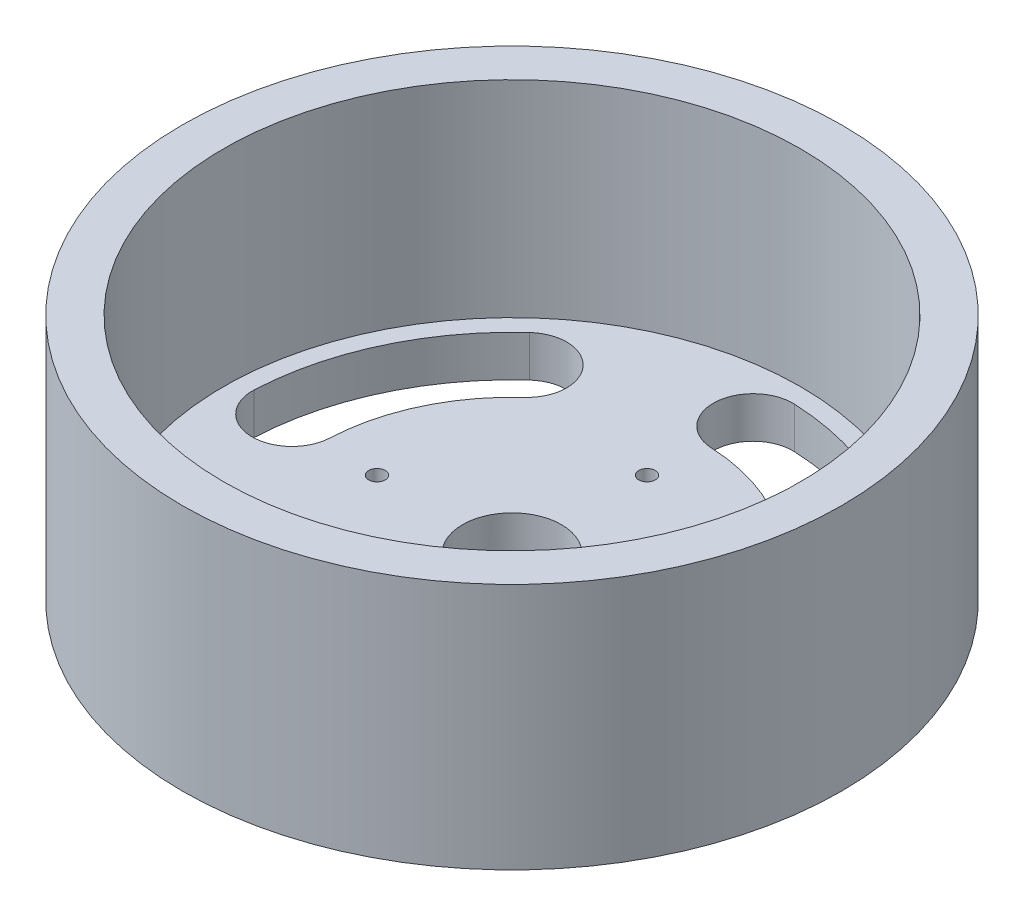
ISO-10303-21;
HEADER;
FILE_DESCRIPTION(('STEP AP214'),'2;1');
FILE_NAME('part.step','',(''),(''),'','','');
FILE_SCHEMA(('AUTOMOTIVE_DESIGN { 1 0 10303 214 1 1 1 1 }'));
ENDSEC;
DATA;
#1=APPLICATION_CONTEXT('core data for automotive mechanical design processes');
#2=APPLICATION_PROTOCOL_DEFINITION('international standard','automotive_design',2000,#1);
#3=PRODUCT_CONTEXT('',#1,'mechanical');
#4=PRODUCT('Part','Part','',(#3));
#5=PRODUCT_RELATED_PRODUCT_CATEGORY('part','',(#4));
#6=PRODUCT_DEFINITION_FORMATION('','',#4);
#7=PRODUCT_DEFINITION_CONTEXT('part definition',#1,'design');
#8=PRODUCT_DEFINITION('design','',#6,#7);
#9=PRODUCT_DEFINITION_SHAPE('','',#8);
#10=(LENGTH_UNIT() NAMED_UNIT(*) SI_UNIT(.MILLI.,.METRE.));
#11=(NAMED_UNIT(*) PLANE_ANGLE_UNIT() SI_UNIT($,.RADIAN.));
#12=(NAMED_UNIT(*) SI_UNIT($,.STERADIAN.) SOLID_ANGLE_UNIT());
#13=UNCERTAINTY_MEASURE_WITH_UNIT(LENGTH_MEASURE(1.E-05),#10,'distance_accuracy_value','');
#14=(GEOMETRIC_REPRESENTATION_CONTEXT(3) GLOBAL_UNCERTAINTY_ASSIGNED_CONTEXT((#13)) GLOBAL_UNIT_ASSIGNED_CONTEXT((#10,
#11,#12)) REPRESENTATION_CONTEXT('',''));
#15=CARTESIAN_POINT('',(0.,0.,0.));
#16=DIRECTION('',(0.,0.,1.));
#17=DIRECTION('',(1.,0.,0.));
#18=AXIS2_PLACEMENT_3D('',#15,#16,#17);
#19=CARTESIAN_POINT('',(0.,5.,0.));
#20=DIRECTION('',(0.,1.,0.));
#21=DIRECTION('',(0.,0.,1.));
#22=AXIS2_PLACEMENT_3D('',#19,#20,#21);
#23=PLANE('',#22);
#24=CARTESIAN_POINT('',(0.,5.,0.));
#25=DIRECTION('',(0.,1.,0.));
#26=DIRECTION('',(0.,0.,1.));
#27=AXIS2_PLACEMENT_3D('',#24,#25,#26);
#28=CIRCLE('',#27,35.);
#29=CARTESIAN_POINT('',(0.,5.,35.));
#30=VERTEX_POINT('',#29);
#31=EDGE_CURVE('E370',#30,#30,#28,.T.);
#32=ORIENTED_EDGE('',*,*,#31,.T.);
#33=EDGE_LOOP('',(#32));
#34=FACE_BOUND('',#33,.T.);
#35=CARTESIAN_POINT('',(-1.27613354937582,5.,27.9709042250006));
#36=DIRECTION('',(0.,1.,0.));
#37=DIRECTION('',(0.,0.,1.));
#38=AXIS2_PLACEMENT_3D('',#35,#36,#37);
#39=CIRCLE('',#38,4.82758620689654);
#40=CARTESIAN_POINT('',(-1.05611052362137,5.,23.148334531035));
#41=VERTEX_POINT('',#40);
#42=CARTESIAN_POINT('',(-1.49615657513027,5.,32.7934739189662));
#43=VERTEX_POINT('',#42);
#44=EDGE_CURVE('E275',#41,#43,#39,.F.);
#45=ORIENTED_EDGE('',*,*,#44,.T.);
#46=CARTESIAN_POINT('',(0.,5.,0.));
#47=DIRECTION('',(0.,1.,0.));
#48=DIRECTION('',(0.,0.,1.));
#49=AXIS2_PLACEMENT_3D('',#46,#47,#48);
#50=CIRCLE('',#49,32.8275862068965);
#51=CARTESIAN_POINT('',(-24.2464302467567,5.,22.1305453267737));
#52=VERTEX_POINT('',#51);
#53=EDGE_CURVE('E242',#43,#52,#50,.F.);
#54=ORIENTED_EDGE('',*,*,#53,.T.);
#55=CARTESIAN_POINT('',(-20.6807787398807,5.,18.8760533669541));
#56=DIRECTION('',(0.,1.,0.));
#57=DIRECTION('',(0.,0.,1.));
#58=AXIS2_PLACEMENT_3D('',#55,#56,#57);
#59=CIRCLE('',#58,4.82758620689655);
#60=CARTESIAN_POINT('',(-17.1151272330047,5.,15.6215614071344));
#61=VERTEX_POINT('',#60);
#62=EDGE_CURVE('E283',#52,#61,#59,.F.);
#63=ORIENTED_EDGE('',*,*,#62,.T.);
#64=CARTESIAN_POINT('',(0.,5.,0.));
#65=DIRECTION('',(0.,1.,0.));
#66=DIRECTION('',(0.,0.,1.));
#67=AXIS2_PLACEMENT_3D('',#64,#65,#66);
#68=CIRCLE('',#67,23.1724137931035);
#69=EDGE_CURVE('E279',#61,#41,#68,.T.);
#70=ORIENTED_EDGE('',*,*,#69,.T.);
#71=EDGE_LOOP('',(#45,#54,#63,#70));
#72=FACE_BOUND('',#71,.T.);
#73=CARTESIAN_POINT('',(27.9709042250006,5.,1.27613354937572));
#74=DIRECTION('',(0.,1.,0.));
#75=DIRECTION('',(0.,0.,1.));
#76=AXIS2_PLACEMENT_3D('',#73,#74,#75);
#77=CIRCLE('',#76,4.82758620689655);
#78=CARTESIAN_POINT('',(23.148334531035,5.,1.05611052362129));
#79=VERTEX_POINT('',#78);
#80=CARTESIAN_POINT('',(32.7934739189663,5.,1.49615657513016));
#81=VERTEX_POINT('',#80);
#82=EDGE_CURVE('E319',#79,#81,#77,.F.);
#83=ORIENTED_EDGE('',*,*,#82,.T.);
#84=CARTESIAN_POINT('',(0.,5.,0.));
#85=DIRECTION('',(0.,1.,0.));
#86=DIRECTION('',(0.,0.,1.));
#87=AXIS2_PLACEMENT_3D('',#84,#85,#86);
#88=CIRCLE('',#87,32.8275862068966);
#89=CARTESIAN_POINT('',(22.1305453267738,5.,24.2464302467566));
#90=VERTEX_POINT('',#89);
#91=EDGE_CURVE('E199',#81,#90,#88,.F.);
#92=ORIENTED_EDGE('',*,*,#91,.T.);
#93=CARTESIAN_POINT('',(18.8760533669541,5.,20.6807787398807));
#94=DIRECTION('',(0.,1.,0.));
#95=DIRECTION('',(0.,0.,1.));
#96=AXIS2_PLACEMENT_3D('',#93,#94,#95);
#97=CIRCLE('',#96,4.82758620689655);
#98=CARTESIAN_POINT('',(15.6215614071345,5.,17.1151272330047));
#99=VERTEX_POINT('',#98);
#100=EDGE_CURVE('E247',#90,#99,#97,.F.);
#101=ORIENTED_EDGE('',*,*,#100,.T.);
#102=CARTESIAN_POINT('',(0.,5.,0.));
#103=DIRECTION('',(0.,1.,0.));
#104=DIRECTION('',(0.,0.,1.));
#105=AXIS2_PLACEMENT_3D('',#102,#103,#104);
#106=CIRCLE('',#105,23.1724137931035);
#107=EDGE_CURVE('E323',#99,#79,#106,.T.);
#108=ORIENTED_EDGE('',*,*,#107,.T.);
#109=EDGE_LOOP('',(#83,#92,#101,#108));
#110=FACE_BOUND('',#109,.T.);
#111=CARTESIAN_POINT('',(1.27613354937563,5.,-27.9709042250006));
#112=DIRECTION('',(0.,1.,0.));
#113=DIRECTION('',(0.,0.,1.));
#114=AXIS2_PLACEMENT_3D('',#111,#112,#113);
#115=CIRCLE('',#114,4.82758620689655);
#116=CARTESIAN_POINT('',(1.05611052362121,5.,-23.148334531035));
#117=VERTEX_POINT('',#116);
#118=CARTESIAN_POINT('',(1.49615657513005,5.,-32.7934739189663));
#119=VERTEX_POINT('',#118);
#120=EDGE_CURVE('E161',#117,#119,#115,.F.);
#121=ORIENTED_EDGE('',*,*,#120,.T.);
#122=CARTESIAN_POINT('',(0.,5.,0.));
#123=DIRECTION('',(0.,1.,0.));
#124=DIRECTION('',(0.,0.,1.));
#125=AXIS2_PLACEMENT_3D('',#122,#123,#124);
#126=CIRCLE('',#125,32.8275862068966);
#127=CARTESIAN_POINT('',(24.2464302467566,5.,-22.1305453267739));
#128=VERTEX_POINT('',#127);
#129=EDGE_CURVE('E166',#119,#128,#126,.F.);
#130=ORIENTED_EDGE('',*,*,#129,.T.);
#131=CARTESIAN_POINT('',(20.6807787398806,5.,-18.8760533669542));
#132=DIRECTION('',(0.,1.,0.));
#133=DIRECTION('',(0.,0.,1.));
#134=AXIS2_PLACEMENT_3D('',#131,#132,#133);
#135=CIRCLE('',#134,4.82758620689655);
#136=CARTESIAN_POINT('',(17.1151272330046,5.,-15.6215614071345));
#137=VERTEX_POINT('',#136);
#138=EDGE_CURVE('E195',#128,#137,#135,.F.);
#139=ORIENTED_EDGE('',*,*,#138,.T.);
#140=CARTESIAN_POINT('',(0.,5.,0.));
#141=DIRECTION('',(0.,1.,0.));
#142=DIRECTION('',(0.,0.,1.));
#143=AXIS2_PLACEMENT_3D('',#140,#141,#142);
#144=CIRCLE('',#143,23.1724137931035);
#145=EDGE_CURVE('E188',#137,#117,#144,.T.);
#146=ORIENTED_EDGE('',*,*,#145,.T.);
#147=EDGE_LOOP('',(#121,#130,#139,#146));
#148=FACE_BOUND('',#147,.T.);
#149=CARTESIAN_POINT('',(-27.9709042250006,5.,-1.27613354937553));
#150=DIRECTION('',(0.,1.,0.));
#151=DIRECTION('',(0.,0.,1.));
#152=AXIS2_PLACEMENT_3D('',#149,#150,#151);
#153=CIRCLE('',#152,4.82758620689654);
#154=CARTESIAN_POINT('',(-23.148334531035,5.,-1.05611052362112));
#155=VERTEX_POINT('',#154);
#156=CARTESIAN_POINT('',(-32.7934739189663,5.,-1.49615657512992));
#157=VERTEX_POINT('',#156);
#158=EDGE_CURVE('E230',#155,#157,#153,.F.);
#159=ORIENTED_EDGE('',*,*,#158,.T.);
#160=CARTESIAN_POINT('',(0.,5.,0.));
#161=DIRECTION('',(0.,1.,0.));
#162=DIRECTION('',(0.,0.,1.));
#163=AXIS2_PLACEMENT_3D('',#160,#161,#162);
#164=CIRCLE('',#163,32.8275862068965);
#165=CARTESIAN_POINT('',(-22.130545326774,5.,-24.2464302467565));
#166=VERTEX_POINT('',#165);
#167=EDGE_CURVE('E200',#157,#166,#164,.F.);
#168=ORIENTED_EDGE('',*,*,#167,.T.);
#169=CARTESIAN_POINT('',(-18.8760533669543,5.,-20.6807787398805));
#170=DIRECTION('',(0.,1.,0.));
#171=DIRECTION('',(0.,0.,1.));
#172=AXIS2_PLACEMENT_3D('',#169,#170,#171);
#173=CIRCLE('',#172,4.82758620689654);
#174=CARTESIAN_POINT('',(-15.6215614071346,5.,-17.1151272330046));
#175=VERTEX_POINT('',#174);
#176=EDGE_CURVE('E238',#166,#175,#173,.F.);
#177=ORIENTED_EDGE('',*,*,#176,.T.);
#178=CARTESIAN_POINT('',(0.,5.,0.));
#179=DIRECTION('',(0.,1.,0.));
#180=DIRECTION('',(0.,0.,1.));
#181=AXIS2_PLACEMENT_3D('',#178,#179,#180);
#182=CIRCLE('',#181,23.1724137931035);
#183=EDGE_CURVE('E234',#175,#155,#182,.T.);
#184=ORIENTED_EDGE('',*,*,#183,.T.);
#185=EDGE_LOOP('',(#159,#168,#177,#184));
#186=FACE_BOUND('',#185,.T.);
#187=CARTESIAN_POINT('',(0.,5.,16.383));
#188=DIRECTION('',(0.,1.,0.));
#189=DIRECTION('',(0.,0.,1.));
#190=AXIS2_PLACEMENT_3D('',#187,#188,#189);
#191=CIRCLE('',#190,1.);
#192=CARTESIAN_POINT('',(0.,5.,17.383));
#193=VERTEX_POINT('',#192);
#194=EDGE_CURVE('E346',#193,#193,#191,.F.);
#195=ORIENTED_EDGE('',*,*,#194,.T.);
#196=EDGE_LOOP('',(#195));
#197=FACE_BOUND('',#196,.T.);
#198=CARTESIAN_POINT('',(-16.383,5.,0.));
#199=DIRECTION('',(0.,1.,0.));
#200=DIRECTION('',(0.,0.,1.));
#201=AXIS2_PLACEMENT_3D('',#198,#199,#200);
#202=CIRCLE('',#201,1.);
#203=CARTESIAN_POINT('',(-16.383,5.,1.));
#204=VERTEX_POINT('',#203);
#205=EDGE_CURVE('E355',#204,#204,#202,.F.);
#206=ORIENTED_EDGE('',*,*,#205,.T.);
#207=EDGE_LOOP('',(#206));
#208=FACE_BOUND('',#207,.T.);
#209=CARTESIAN_POINT('',(16.383,5.,0.));
#210=DIRECTION('',(0.,1.,0.));
#211=DIRECTION('',(0.,0.,1.));
#212=AXIS2_PLACEMENT_3D('',#209,#210,#211);
#213=CIRCLE('',#212,1.);
#214=CARTESIAN_POINT('',(16.383,5.,1.));
#215=VERTEX_POINT('',#214);
#216=EDGE_CURVE('E330',#215,#215,#213,.F.);
#217=ORIENTED_EDGE('',*,*,#216,.T.);
#218=EDGE_LOOP('',(#217));
#219=FACE_BOUND('',#218,.T.);
#220=CARTESIAN_POINT('',(0.,5.,-16.383));
#221=DIRECTION('',(0.,1.,0.));
#222=DIRECTION('',(0.,0.,1.));
#223=AXIS2_PLACEMENT_3D('',#220,#221,#222);
#224=CIRCLE('',#223,1.);
#225=CARTESIAN_POINT('',(0.,5.,-15.383));
#226=VERTEX_POINT('',#225);
#227=EDGE_CURVE('E339',#226,#226,#224,.F.);
#228=ORIENTED_EDGE('',*,*,#227,.T.);
#229=EDGE_LOOP('',(#228));
#230=FACE_BOUND('',#229,.T.);
#231=CARTESIAN_POINT('',(0.,5.,0.));
#232=DIRECTION('',(0.,1.,0.));
#233=DIRECTION('',(0.,0.,1.));
#234=AXIS2_PLACEMENT_3D('',#231,#232,#233);
#235=CIRCLE('',#234,6.);
#236=CARTESIAN_POINT('',(0.,5.,6.));
#237=VERTEX_POINT('',#236);
#238=EDGE_CURVE('E350',#237,#237,#235,.F.);
#239=ORIENTED_EDGE('',*,*,#238,.T.);
#240=EDGE_LOOP('',(#239));
#241=FACE_BOUND('',#240,.T.);
#242=ADVANCED_FACE('F43',(#34,#72,#110,#148,#186,#197,#208,#219,#230,#241),#23,.T.);
#243=CARTESIAN_POINT('',(0.,30.,0.));
#244=DIRECTION('',(0.,-1.,0.));
#245=DIRECTION('',(0.,0.,-1.));
#246=AXIS2_PLACEMENT_3D('',#243,#244,#245);
#247=CYLINDRICAL_SURFACE('',#246,40.);
#248=CARTESIAN_POINT('',(0.,30.,0.));
#249=DIRECTION('',(0.,1.,0.));
#250=DIRECTION('',(0.,0.,1.));
#251=AXIS2_PLACEMENT_3D('',#248,#249,#250);
#252=CIRCLE('',#251,40.);
#253=CARTESIAN_POINT('',(0.,30.,40.));
#254=VERTEX_POINT('',#253);
#255=EDGE_CURVE('E11',#254,#254,#252,.T.);
#256=ORIENTED_EDGE('',*,*,#255,.F.);
#257=EDGE_LOOP('',(#256));
#258=FACE_BOUND('',#257,.T.);
#259=CARTESIAN_POINT('',(0.,0.,0.));
#260=DIRECTION('',(0.,1.,0.));
#261=DIRECTION('',(0.,0.,1.));
#262=AXIS2_PLACEMENT_3D('',#259,#260,#261);
#263=CIRCLE('',#262,40.);
#264=CARTESIAN_POINT('',(0.,0.,40.));
#265=VERTEX_POINT('',#264);
#266=EDGE_CURVE('E47',#265,#265,#263,.T.);
#267=ORIENTED_EDGE('',*,*,#266,.T.);
#268=EDGE_LOOP('',(#267));
#269=FACE_BOUND('',#268,.T.);
#270=ADVANCED_FACE('F45',(#258,#269),#247,.T.);
#271=CARTESIAN_POINT('',(0.,30.,0.));
#272=DIRECTION('',(0.,1.,0.));
#273=DIRECTION('',(0.,0.,1.));
#274=AXIS2_PLACEMENT_3D('',#271,#272,#273);
#275=PLANE('',#274);
#276=CARTESIAN_POINT('',(0.,30.,0.));
#277=DIRECTION('',(0.,1.,0.));
#278=DIRECTION('',(0.,0.,1.));
#279=AXIS2_PLACEMENT_3D('',#276,#277,#278);
#280=CIRCLE('',#279,35.);
#281=CARTESIAN_POINT('',(0.,30.,35.));
#282=VERTEX_POINT('',#281);
#283=EDGE_CURVE('E366',#282,#282,#280,.T.);
#284=ORIENTED_EDGE('',*,*,#283,.F.);
#285=EDGE_LOOP('',(#284));
#286=FACE_BOUND('',#285,.T.);
#287=ORIENTED_EDGE('',*,*,#255,.T.);
#288=EDGE_LOOP('',(#287));
#289=FACE_BOUND('',#288,.T.);
#290=ADVANCED_FACE('F380',(#286,#289),#275,.T.);
#291=CARTESIAN_POINT('',(0.,0.,0.));
#292=DIRECTION('',(0.,1.,0.));
#293=DIRECTION('',(0.,0.,1.));
#294=AXIS2_PLACEMENT_3D('',#291,#292,#293);
#295=PLANE('',#294);
#296=CARTESIAN_POINT('',(0.,0.,-16.383));
#297=DIRECTION('',(0.,-1.,0.));
#298=DIRECTION('',(0.,0.,-1.));
#299=AXIS2_PLACEMENT_3D('',#296,#297,#298);
#300=CIRCLE('',#299,1.);
#301=CARTESIAN_POINT('',(0.,0.,-17.383));
#302=VERTEX_POINT('',#301);
#303=EDGE_CURVE('E287',#302,#302,#300,.T.);
#304=ORIENTED_EDGE('',*,*,#303,.F.);
#305=EDGE_LOOP('',(#304));
#306=FACE_BOUND('',#305,.T.);
#307=CARTESIAN_POINT('',(16.383,0.,0.));
#308=DIRECTION('',(0.,-1.,0.));
#309=DIRECTION('',(0.,0.,-1.));
#310=AXIS2_PLACEMENT_3D('',#307,#308,#309);
#311=CIRCLE('',#310,1.);
#312=CARTESIAN_POINT('',(16.383,0.,-1.));
#313=VERTEX_POINT('',#312);
#314=EDGE_CURVE('E335',#313,#313,#311,.T.);
#315=ORIENTED_EDGE('',*,*,#314,.F.);
#316=EDGE_LOOP('',(#315));
#317=FACE_BOUND('',#316,.T.);
#318=CARTESIAN_POINT('',(-16.383,0.,0.));
#319=DIRECTION('',(0.,-1.,0.));
#320=DIRECTION('',(0.,0.,-1.));
#321=AXIS2_PLACEMENT_3D('',#318,#319,#320);
#322=CIRCLE('',#321,1.);
#323=CARTESIAN_POINT('',(-16.383,0.,-1.));
#324=VERTEX_POINT('',#323);
#325=EDGE_CURVE('E334',#324,#324,#322,.T.);
#326=ORIENTED_EDGE('',*,*,#325,.F.);
#327=EDGE_LOOP('',(#326));
#328=FACE_BOUND('',#327,.T.);
#329=CARTESIAN_POINT('',(0.,0.,16.383));
#330=DIRECTION('',(0.,-1.,0.));
#331=DIRECTION('',(0.,0.,-1.));
#332=AXIS2_PLACEMENT_3D('',#329,#330,#331);
#333=CIRCLE('',#332,1.);
#334=CARTESIAN_POINT('',(0.,0.,15.383));
#335=VERTEX_POINT('',#334);
#336=EDGE_CURVE('E351',#335,#335,#333,.T.);
#337=ORIENTED_EDGE('',*,*,#336,.F.);
#338=EDGE_LOOP('',(#337));
#339=FACE_BOUND('',#338,.T.);
#340=CARTESIAN_POINT('',(0.,0.,0.));
#341=DIRECTION('',(0.,-1.,0.));
#342=DIRECTION('',(0.,0.,-1.));
#343=AXIS2_PLACEMENT_3D('',#340,#341,#342);
#344=CIRCLE('',#343,32.8275862068965);
#345=CARTESIAN_POINT('',(-32.7934739189663,0.,-1.49615657512992));
#346=VERTEX_POINT('',#345);
#347=CARTESIAN_POINT('',(-22.130545326774,0.,-24.2464302467565));
#348=VERTEX_POINT('',#347);
#349=EDGE_CURVE('E224',#346,#348,#344,.T.);
#350=ORIENTED_EDGE('',*,*,#349,.F.);
#351=CARTESIAN_POINT('',(-27.9709042250006,0.,-1.27613354937553));
#352=DIRECTION('',(0.,-1.,0.));
#353=DIRECTION('',(0.,0.,-1.));
#354=AXIS2_PLACEMENT_3D('',#351,#352,#353);
#355=CIRCLE('',#354,4.82758620689654);
#356=CARTESIAN_POINT('',(-23.148334531035,0.,-1.05611052362112));
#357=VERTEX_POINT('',#356);
#358=EDGE_CURVE('E59',#357,#346,#355,.T.);
#359=ORIENTED_EDGE('',*,*,#358,.F.);
#360=CARTESIAN_POINT('',(0.,0.,0.));
#361=DIRECTION('',(0.,1.,0.));
#362=DIRECTION('',(0.,0.,-1.));
#363=AXIS2_PLACEMENT_3D('',#360,#361,#362);
#364=CIRCLE('',#363,23.1724137931035);
#365=CARTESIAN_POINT('',(-15.6215614071346,0.,-17.1151272330046));
#366=VERTEX_POINT('',#365);
#367=EDGE_CURVE('E208',#366,#357,#364,.T.);
#368=ORIENTED_EDGE('',*,*,#367,.F.);
#369=CARTESIAN_POINT('',(-18.8760533669543,0.,-20.6807787398805));
#370=DIRECTION('',(0.,-1.,0.));
#371=DIRECTION('',(0.,0.,-1.));
#372=AXIS2_PLACEMENT_3D('',#369,#370,#371);
#373=CIRCLE('',#372,4.82758620689654);
#374=EDGE_CURVE('E220',#348,#366,#373,.T.);
#375=ORIENTED_EDGE('',*,*,#374,.F.);
#376=EDGE_LOOP('',(#350,#359,#368,#375));
#377=FACE_BOUND('',#376,.T.);
#378=CARTESIAN_POINT('',(0.,0.,0.));
#379=DIRECTION('',(0.,-1.,0.));
#380=DIRECTION('',(0.,0.,-1.));
#381=AXIS2_PLACEMENT_3D('',#378,#379,#380);
#382=CIRCLE('',#381,32.8275862068966);
#383=CARTESIAN_POINT('',(1.49615657513005,0.,-32.7934739189663));
#384=VERTEX_POINT('',#383);
#385=CARTESIAN_POINT('',(24.2464302467566,0.,-22.1305453267739));
#386=VERTEX_POINT('',#385);
#387=EDGE_CURVE('E183',#384,#386,#382,.T.);
#388=ORIENTED_EDGE('',*,*,#387,.F.);
#389=CARTESIAN_POINT('',(1.27613354937563,0.,-27.9709042250006));
#390=DIRECTION('',(0.,-1.,0.));
#391=DIRECTION('',(0.,0.,-1.));
#392=AXIS2_PLACEMENT_3D('',#389,#390,#391);
#393=CIRCLE('',#392,4.82758620689655);
#394=CARTESIAN_POINT('',(1.05611052362121,0.,-23.148334531035));
#395=VERTEX_POINT('',#394);
#396=EDGE_CURVE('E67',#395,#384,#393,.T.);
#397=ORIENTED_EDGE('',*,*,#396,.F.);
#398=CARTESIAN_POINT('',(0.,0.,0.));
#399=DIRECTION('',(0.,1.,0.));
#400=DIRECTION('',(0.,0.,-1.));
#401=AXIS2_PLACEMENT_3D('',#398,#399,#400);
#402=CIRCLE('',#401,23.1724137931035);
#403=CARTESIAN_POINT('',(17.1151272330046,0.,-15.6215614071345));
#404=VERTEX_POINT('',#403);
#405=EDGE_CURVE('E169',#404,#395,#402,.T.);
#406=ORIENTED_EDGE('',*,*,#405,.F.);
#407=CARTESIAN_POINT('',(20.6807787398806,0.,-18.8760533669542));
#408=DIRECTION('',(0.,-1.,0.));
#409=DIRECTION('',(0.,0.,-1.));
#410=AXIS2_PLACEMENT_3D('',#407,#408,#409);
#411=CIRCLE('',#410,4.82758620689655);
#412=EDGE_CURVE('E176',#386,#404,#411,.T.);
#413=ORIENTED_EDGE('',*,*,#412,.F.);
#414=EDGE_LOOP('',(#388,#397,#406,#413));
#415=FACE_BOUND('',#414,.T.);
#416=CARTESIAN_POINT('',(0.,0.,0.));
#417=DIRECTION('',(0.,-1.,0.));
#418=DIRECTION('',(0.,0.,-1.));
#419=AXIS2_PLACEMENT_3D('',#416,#417,#418);
#420=CIRCLE('',#419,32.8275862068966);
#421=CARTESIAN_POINT('',(32.7934739189663,0.,1.49615657513016));
#422=VERTEX_POINT('',#421);
#423=CARTESIAN_POINT('',(22.1305453267738,0.,24.2464302467566));
#424=VERTEX_POINT('',#423);
#425=EDGE_CURVE('E312',#422,#424,#420,.T.);
#426=ORIENTED_EDGE('',*,*,#425,.F.);
#427=CARTESIAN_POINT('',(27.9709042250006,0.,1.27613354937572));
#428=DIRECTION('',(0.,-1.,0.));
#429=DIRECTION('',(0.,0.,-1.));
#430=AXIS2_PLACEMENT_3D('',#427,#428,#429);
#431=CIRCLE('',#430,4.82758620689655);
#432=CARTESIAN_POINT('',(23.148334531035,0.,1.05611052362129));
#433=VERTEX_POINT('',#432);
#434=EDGE_CURVE('E316',#433,#422,#431,.T.);
#435=ORIENTED_EDGE('',*,*,#434,.F.);
#436=CARTESIAN_POINT('',(0.,0.,0.));
#437=DIRECTION('',(0.,1.,0.));
#438=DIRECTION('',(0.,0.,-1.));
#439=AXIS2_PLACEMENT_3D('',#436,#437,#438);
#440=CIRCLE('',#439,23.1724137931035);
#441=CARTESIAN_POINT('',(15.6215614071345,0.,17.1151272330047));
#442=VERTEX_POINT('',#441);
#443=EDGE_CURVE('E296',#442,#433,#440,.T.);
#444=ORIENTED_EDGE('',*,*,#443,.F.);
#445=CARTESIAN_POINT('',(18.8760533669541,0.,20.6807787398807));
#446=DIRECTION('',(0.,-1.,0.));
#447=DIRECTION('',(0.,0.,-1.));
#448=AXIS2_PLACEMENT_3D('',#445,#446,#447);
#449=CIRCLE('',#448,4.82758620689655);
#450=EDGE_CURVE('E308',#424,#442,#449,.T.);
#451=ORIENTED_EDGE('',*,*,#450,.F.);
#452=EDGE_LOOP('',(#426,#435,#444,#451));
#453=FACE_BOUND('',#452,.T.);
#454=CARTESIAN_POINT('',(0.,0.,0.));
#455=DIRECTION('',(0.,-1.,0.));
#456=DIRECTION('',(0.,0.,-1.));
#457=AXIS2_PLACEMENT_3D('',#454,#455,#456);
#458=CIRCLE('',#457,32.8275862068965);
#459=CARTESIAN_POINT('',(-1.49615657513027,0.,32.7934739189662));
#460=VERTEX_POINT('',#459);
#461=CARTESIAN_POINT('',(-24.2464302467567,0.,22.1305453267737));
#462=VERTEX_POINT('',#461);
#463=EDGE_CURVE('E268',#460,#462,#458,.T.);
#464=ORIENTED_EDGE('',*,*,#463,.F.);
#465=CARTESIAN_POINT('',(-1.27613354937582,0.,27.9709042250006));
#466=DIRECTION('',(0.,-1.,0.));
#467=DIRECTION('',(0.,0.,-1.));
#468=AXIS2_PLACEMENT_3D('',#465,#466,#467);
#469=CIRCLE('',#468,4.82758620689654);
#470=CARTESIAN_POINT('',(-1.05611052362137,0.,23.148334531035));
#471=VERTEX_POINT('',#470);
#472=EDGE_CURVE('E272',#471,#460,#469,.T.);
#473=ORIENTED_EDGE('',*,*,#472,.F.);
#474=CARTESIAN_POINT('',(0.,0.,0.));
#475=DIRECTION('',(0.,1.,0.));
#476=DIRECTION('',(0.,0.,-1.));
#477=AXIS2_PLACEMENT_3D('',#474,#475,#476);
#478=CIRCLE('',#477,23.1724137931035);
#479=CARTESIAN_POINT('',(-17.1151272330047,0.,15.6215614071344));
#480=VERTEX_POINT('',#479);
#481=EDGE_CURVE('E252',#480,#471,#478,.T.);
#482=ORIENTED_EDGE('',*,*,#481,.F.);
#483=CARTESIAN_POINT('',(-20.6807787398807,0.,18.8760533669541));
#484=DIRECTION('',(0.,-1.,0.));
#485=DIRECTION('',(0.,0.,-1.));
#486=AXIS2_PLACEMENT_3D('',#483,#484,#485);
#487=CIRCLE('',#486,4.82758620689655);
#488=EDGE_CURVE('E264',#462,#480,#487,.T.);
#489=ORIENTED_EDGE('',*,*,#488,.F.);
#490=EDGE_LOOP('',(#464,#473,#482,#489));
#491=FACE_BOUND('',#490,.T.);
#492=CARTESIAN_POINT('',(0.,0.,0.));
#493=DIRECTION('',(0.,-1.,0.));
#494=DIRECTION('',(0.,0.,-1.));
#495=AXIS2_PLACEMENT_3D('',#492,#493,#494);
#496=CIRCLE('',#495,6.);
#497=CARTESIAN_POINT('',(0.,0.,-6.));
#498=VERTEX_POINT('',#497);
#499=EDGE_CURVE('E362',#498,#498,#496,.T.);
#500=ORIENTED_EDGE('',*,*,#499,.F.);
#501=EDGE_LOOP('',(#500));
#502=FACE_BOUND('',#501,.T.);
#503=ORIENTED_EDGE('',*,*,#266,.F.);
#504=EDGE_LOOP('',(#503));
#505=FACE_BOUND('',#504,.T.);
#506=ADVANCED_FACE('F180',(#306,#317,#328,#339,#377,#415,#453,#491,#502,#505),#295,.F.);
#507=CARTESIAN_POINT('',(0.,5.,0.));
#508=DIRECTION('',(0.,1.,0.));
#509=DIRECTION('',(0.,0.,1.));
#510=AXIS2_PLACEMENT_3D('',#507,#508,#509);
#511=CYLINDRICAL_SURFACE('',#510,35.);
#512=ORIENTED_EDGE('',*,*,#31,.F.);
#513=EDGE_LOOP('',(#512));
#514=FACE_BOUND('',#513,.T.);
#515=ORIENTED_EDGE('',*,*,#283,.T.);
#516=EDGE_LOOP('',(#515));
#517=FACE_BOUND('',#516,.T.);
#518=ADVANCED_FACE('F378',(#514,#517),#511,.F.);
#519=CARTESIAN_POINT('',(-1.27613354937582,30.001,27.9709042250006));
#520=DIRECTION('',(0.,-1.,0.));
#521=DIRECTION('',(0.,0.,-1.));
#522=AXIS2_PLACEMENT_3D('',#519,#520,#521);
#523=CYLINDRICAL_SURFACE('',#522,4.82758620689654);
#524=DIRECTION('',(0.,-1.,0.));
#525=VECTOR('',#524,1.);
#526=CARTESIAN_POINT('',(-1.05611052362137,30.001,23.148334531035));
#527=LINE('',#526,#525);
#528=EDGE_CURVE('E246',#41,#471,#527,.T.);
#529=ORIENTED_EDGE('',*,*,#528,.T.);
#530=ORIENTED_EDGE('',*,*,#472,.T.);
#531=DIRECTION('',(0.,-1.,0.));
#532=VECTOR('',#531,1.);
#533=CARTESIAN_POINT('',(-1.49615657513027,30.001,32.7934739189662));
#534=LINE('',#533,#532);
#535=EDGE_CURVE('E248',#43,#460,#534,.T.);
#536=ORIENTED_EDGE('',*,*,#535,.F.);
#537=ORIENTED_EDGE('',*,*,#44,.F.);
#538=EDGE_LOOP('',(#529,#530,#536,#537));
#539=FACE_BOUND('',#538,.T.);
#540=ADVANCED_FACE('F397',(#539),#523,.F.);
#541=CARTESIAN_POINT('',(0.,30.001,0.));
#542=DIRECTION('',(0.,-1.,0.));
#543=DIRECTION('',(0.,0.,-1.));
#544=AXIS2_PLACEMENT_3D('',#541,#542,#543);
#545=CYLINDRICAL_SURFACE('',#544,23.1724137931035);
#546=DIRECTION('',(0.,-1.,0.));
#547=VECTOR('',#546,1.);
#548=CARTESIAN_POINT('',(-17.1151272330047,30.001,15.6215614071344));
#549=LINE('',#548,#547);
#550=EDGE_CURVE('E256',#61,#480,#549,.T.);
#551=ORIENTED_EDGE('',*,*,#550,.T.);
#552=ORIENTED_EDGE('',*,*,#481,.T.);
#553=ORIENTED_EDGE('',*,*,#528,.F.);
#554=ORIENTED_EDGE('',*,*,#69,.F.);
#555=EDGE_LOOP('',(#551,#552,#553,#554));
#556=FACE_BOUND('',#555,.T.);
#557=ADVANCED_FACE('F447',(#556),#545,.T.);
#558=CARTESIAN_POINT('',(-20.6807787398807,30.001,18.8760533669541));
#559=DIRECTION('',(0.,-1.,0.));
#560=DIRECTION('',(0.,0.,-1.));
#561=AXIS2_PLACEMENT_3D('',#558,#559,#560);
#562=CYLINDRICAL_SURFACE('',#561,4.82758620689655);
#563=DIRECTION('',(0.,-1.,0.));
#564=VECTOR('',#563,1.);
#565=CARTESIAN_POINT('',(-24.2464302467567,30.001,22.1305453267737));
#566=LINE('',#565,#564);
#567=EDGE_CURVE('E253',#52,#462,#566,.T.);
#568=ORIENTED_EDGE('',*,*,#567,.T.);
#569=ORIENTED_EDGE('',*,*,#488,.T.);
#570=ORIENTED_EDGE('',*,*,#550,.F.);
#571=ORIENTED_EDGE('',*,*,#62,.F.);
#572=EDGE_LOOP('',(#568,#569,#570,#571));
#573=FACE_BOUND('',#572,.T.);
#574=ADVANCED_FACE('F450',(#573),#562,.F.);
#575=CARTESIAN_POINT('',(0.,30.001,0.));
#576=DIRECTION('',(0.,-1.,0.));
#577=DIRECTION('',(0.,0.,-1.));
#578=AXIS2_PLACEMENT_3D('',#575,#576,#577);
#579=CYLINDRICAL_SURFACE('',#578,32.8275862068965);
#580=ORIENTED_EDGE('',*,*,#535,.T.);
#581=ORIENTED_EDGE('',*,*,#463,.T.);
#582=ORIENTED_EDGE('',*,*,#567,.F.);
#583=ORIENTED_EDGE('',*,*,#53,.F.);
#584=EDGE_LOOP('',(#580,#581,#582,#583));
#585=FACE_BOUND('',#584,.T.);
#586=ADVANCED_FACE('F445',(#585),#579,.F.);
#587=CARTESIAN_POINT('',(27.9709042250006,30.001,1.27613354937572));
#588=DIRECTION('',(0.,-1.,0.));
#589=DIRECTION('',(0.,0.,-1.));
#590=AXIS2_PLACEMENT_3D('',#587,#588,#589);
#591=CYLINDRICAL_SURFACE('',#590,4.82758620689655);
#592=DIRECTION('',(0.,-1.,0.));
#593=VECTOR('',#592,1.);
#594=CARTESIAN_POINT('',(23.148334531035,30.001,1.05611052362129));
#595=LINE('',#594,#593);
#596=EDGE_CURVE('E291',#79,#433,#595,.T.);
#597=ORIENTED_EDGE('',*,*,#596,.T.);
#598=ORIENTED_EDGE('',*,*,#434,.T.);
#599=DIRECTION('',(0.,-1.,0.));
#600=VECTOR('',#599,1.);
#601=CARTESIAN_POINT('',(32.7934739189663,30.001,1.49615657513016));
#602=LINE('',#601,#600);
#603=EDGE_CURVE('E292',#81,#422,#602,.T.);
#604=ORIENTED_EDGE('',*,*,#603,.F.);
#605=ORIENTED_EDGE('',*,*,#82,.F.);
#606=EDGE_LOOP('',(#597,#598,#604,#605));
#607=FACE_BOUND('',#606,.T.);
#608=ADVANCED_FACE('F434',(#607),#591,.F.);
#609=CARTESIAN_POINT('',(0.,30.001,0.));
#610=DIRECTION('',(0.,-1.,0.));
#611=DIRECTION('',(0.,0.,-1.));
#612=AXIS2_PLACEMENT_3D('',#609,#610,#611);
#613=CYLINDRICAL_SURFACE('',#612,23.1724137931035);
#614=DIRECTION('',(0.,-1.,0.));
#615=VECTOR('',#614,1.);
#616=CARTESIAN_POINT('',(15.6215614071345,30.001,17.1151272330047));
#617=LINE('',#616,#615);
#618=EDGE_CURVE('E300',#99,#442,#617,.T.);
#619=ORIENTED_EDGE('',*,*,#618,.T.);
#620=ORIENTED_EDGE('',*,*,#443,.T.);
#621=ORIENTED_EDGE('',*,*,#596,.F.);
#622=ORIENTED_EDGE('',*,*,#107,.F.);
#623=EDGE_LOOP('',(#619,#620,#621,#622));
#624=FACE_BOUND('',#623,.T.);
#625=ADVANCED_FACE('F430',(#624),#613,.T.);
#626=CARTESIAN_POINT('',(18.8760533669541,30.001,20.6807787398807));
#627=DIRECTION('',(0.,-1.,0.));
#628=DIRECTION('',(0.,0.,-1.));
#629=AXIS2_PLACEMENT_3D('',#626,#627,#628);
#630=CYLINDRICAL_SURFACE('',#629,4.82758620689655);
#631=DIRECTION('',(0.,-1.,0.));
#632=VECTOR('',#631,1.);
#633=CARTESIAN_POINT('',(22.1305453267738,30.001,24.2464302467566));
#634=LINE('',#633,#632);
#635=EDGE_CURVE('E297',#90,#424,#634,.T.);
#636=ORIENTED_EDGE('',*,*,#635,.T.);
#637=ORIENTED_EDGE('',*,*,#450,.T.);
#638=ORIENTED_EDGE('',*,*,#618,.F.);
#639=ORIENTED_EDGE('',*,*,#100,.F.);
#640=EDGE_LOOP('',(#636,#637,#638,#639));
#641=FACE_BOUND('',#640,.T.);
#642=ADVANCED_FACE('F433',(#641),#630,.F.);
#643=CARTESIAN_POINT('',(0.,30.001,0.));
#644=DIRECTION('',(0.,-1.,0.));
#645=DIRECTION('',(0.,0.,-1.));
#646=AXIS2_PLACEMENT_3D('',#643,#644,#645);
#647=CYLINDRICAL_SURFACE('',#646,32.8275862068966);
#648=ORIENTED_EDGE('',*,*,#603,.T.);
#649=ORIENTED_EDGE('',*,*,#425,.T.);
#650=ORIENTED_EDGE('',*,*,#635,.F.);
#651=ORIENTED_EDGE('',*,*,#91,.F.);
#652=EDGE_LOOP('',(#648,#649,#650,#651));
#653=FACE_BOUND('',#652,.T.);
#654=ADVANCED_FACE('F438',(#653),#647,.F.);
#655=CARTESIAN_POINT('',(1.27613354937563,30.001,-27.9709042250006));
#656=DIRECTION('',(0.,-1.,0.));
#657=DIRECTION('',(0.,0.,-1.));
#658=AXIS2_PLACEMENT_3D('',#655,#656,#657);
#659=CYLINDRICAL_SURFACE('',#658,4.82758620689655);
#660=DIRECTION('',(0.,-1.,0.));
#661=VECTOR('',#660,1.);
#662=CARTESIAN_POINT('',(1.05611052362121,30.001,-23.148334531035));
#663=LINE('',#662,#661);
#664=EDGE_CURVE('E157',#117,#395,#663,.T.);
#665=ORIENTED_EDGE('',*,*,#664,.T.);
#666=ORIENTED_EDGE('',*,*,#396,.T.);
#667=DIRECTION('',(0.,-1.,0.));
#668=VECTOR('',#667,1.);
#669=CARTESIAN_POINT('',(1.49615657513005,30.001,-32.7934739189663));
#670=LINE('',#669,#668);
#671=EDGE_CURVE('E177',#119,#384,#670,.T.);
#672=ORIENTED_EDGE('',*,*,#671,.F.);
#673=ORIENTED_EDGE('',*,*,#120,.F.);
#674=EDGE_LOOP('',(#665,#666,#672,#673));
#675=FACE_BOUND('',#674,.T.);
#676=ADVANCED_FACE('F159',(#675),#659,.F.);
#677=CARTESIAN_POINT('',(0.,30.001,0.));
#678=DIRECTION('',(0.,-1.,0.));
#679=DIRECTION('',(0.,0.,-1.));
#680=AXIS2_PLACEMENT_3D('',#677,#678,#679);
#681=CYLINDRICAL_SURFACE('',#680,23.1724137931035);
#682=DIRECTION('',(0.,-1.,0.));
#683=VECTOR('',#682,1.);
#684=CARTESIAN_POINT('',(17.1151272330046,30.001,-15.6215614071345));
#685=LINE('',#684,#683);
#686=EDGE_CURVE('E165',#137,#404,#685,.T.);
#687=ORIENTED_EDGE('',*,*,#686,.T.);
#688=ORIENTED_EDGE('',*,*,#405,.T.);
#689=ORIENTED_EDGE('',*,*,#664,.F.);
#690=ORIENTED_EDGE('',*,*,#145,.F.);
#691=EDGE_LOOP('',(#687,#688,#689,#690));
#692=FACE_BOUND('',#691,.T.);
#693=ADVANCED_FACE('F170',(#692),#681,.T.);
#694=CARTESIAN_POINT('',(20.6807787398806,30.001,-18.8760533669542));
#695=DIRECTION('',(0.,-1.,0.));
#696=DIRECTION('',(0.,0.,-1.));
#697=AXIS2_PLACEMENT_3D('',#694,#695,#696);
#698=CYLINDRICAL_SURFACE('',#697,4.82758620689655);
#699=DIRECTION('',(0.,-1.,0.));
#700=VECTOR('',#699,1.);
#701=CARTESIAN_POINT('',(24.2464302467566,30.001,-22.1305453267739));
#702=LINE('',#701,#700);
#703=EDGE_CURVE('E692',#128,#386,#702,.T.);
#704=ORIENTED_EDGE('',*,*,#703,.T.);
#705=ORIENTED_EDGE('',*,*,#412,.T.);
#706=ORIENTED_EDGE('',*,*,#686,.F.);
#707=ORIENTED_EDGE('',*,*,#138,.F.);
#708=EDGE_LOOP('',(#704,#705,#706,#707));
#709=FACE_BOUND('',#708,.T.);
#710=ADVANCED_FACE('F478',(#709),#698,.F.);
#711=CARTESIAN_POINT('',(0.,30.001,0.));
#712=DIRECTION('',(0.,-1.,0.));
#713=DIRECTION('',(0.,0.,-1.));
#714=AXIS2_PLACEMENT_3D('',#711,#712,#713);
#715=CYLINDRICAL_SURFACE('',#714,32.8275862068966);
#716=ORIENTED_EDGE('',*,*,#671,.T.);
#717=ORIENTED_EDGE('',*,*,#387,.T.);
#718=ORIENTED_EDGE('',*,*,#703,.F.);
#719=ORIENTED_EDGE('',*,*,#129,.F.);
#720=EDGE_LOOP('',(#716,#717,#718,#719));
#721=FACE_BOUND('',#720,.T.);
#722=ADVANCED_FACE('F475',(#721),#715,.F.);
#723=CARTESIAN_POINT('',(-27.9709042250006,30.001,-1.27613354937553));
#724=DIRECTION('',(0.,-1.,0.));
#725=DIRECTION('',(0.,0.,-1.));
#726=AXIS2_PLACEMENT_3D('',#723,#724,#725);
#727=CYLINDRICAL_SURFACE('',#726,4.82758620689654);
#728=DIRECTION('',(0.,-1.,0.));
#729=VECTOR('',#728,1.);
#730=CARTESIAN_POINT('',(-23.148334531035,30.001,-1.05611052362112));
#731=LINE('',#730,#729);
#732=EDGE_CURVE('E204',#155,#357,#731,.T.);
#733=ORIENTED_EDGE('',*,*,#732,.T.);
#734=ORIENTED_EDGE('',*,*,#358,.T.);
#735=DIRECTION('',(0.,-1.,0.));
#736=VECTOR('',#735,1.);
#737=CARTESIAN_POINT('',(-32.7934739189663,30.001,-1.49615657512992));
#738=LINE('',#737,#736);
#739=EDGE_CURVE('E205',#157,#346,#738,.T.);
#740=ORIENTED_EDGE('',*,*,#739,.F.);
#741=ORIENTED_EDGE('',*,*,#158,.F.);
#742=EDGE_LOOP('',(#733,#734,#740,#741));
#743=FACE_BOUND('',#742,.T.);
#744=ADVANCED_FACE('F465',(#743),#727,.F.);
#745=CARTESIAN_POINT('',(0.,30.001,0.));
#746=DIRECTION('',(0.,-1.,0.));
#747=DIRECTION('',(0.,0.,-1.));
#748=AXIS2_PLACEMENT_3D('',#745,#746,#747);
#749=CYLINDRICAL_SURFACE('',#748,23.1724137931035);
#750=DIRECTION('',(0.,-1.,0.));
#751=VECTOR('',#750,1.);
#752=CARTESIAN_POINT('',(-15.6215614071346,30.001,-17.1151272330046));
#753=LINE('',#752,#751);
#754=EDGE_CURVE('E212',#175,#366,#753,.T.);
#755=ORIENTED_EDGE('',*,*,#754,.T.);
#756=ORIENTED_EDGE('',*,*,#367,.T.);
#757=ORIENTED_EDGE('',*,*,#732,.F.);
#758=ORIENTED_EDGE('',*,*,#183,.F.);
#759=EDGE_LOOP('',(#755,#756,#757,#758));
#760=FACE_BOUND('',#759,.T.);
#761=ADVANCED_FACE('F461',(#760),#749,.T.);
#762=CARTESIAN_POINT('',(-18.8760533669543,30.001,-20.6807787398805));
#763=DIRECTION('',(0.,-1.,0.));
#764=DIRECTION('',(0.,0.,-1.));
#765=AXIS2_PLACEMENT_3D('',#762,#763,#764);
#766=CYLINDRICAL_SURFACE('',#765,4.82758620689654);
#767=DIRECTION('',(0.,-1.,0.));
#768=VECTOR('',#767,1.);
#769=CARTESIAN_POINT('',(-22.130545326774,30.001,-24.2464302467565));
#770=LINE('',#769,#768);
#771=EDGE_CURVE('E209',#166,#348,#770,.T.);
#772=ORIENTED_EDGE('',*,*,#771,.T.);
#773=ORIENTED_EDGE('',*,*,#374,.T.);
#774=ORIENTED_EDGE('',*,*,#754,.F.);
#775=ORIENTED_EDGE('',*,*,#176,.F.);
#776=EDGE_LOOP('',(#772,#773,#774,#775));
#777=FACE_BOUND('',#776,.T.);
#778=ADVANCED_FACE('F464',(#777),#766,.F.);
#779=CARTESIAN_POINT('',(0.,30.001,0.));
#780=DIRECTION('',(0.,-1.,0.));
#781=DIRECTION('',(0.,0.,-1.));
#782=AXIS2_PLACEMENT_3D('',#779,#780,#781);
#783=CYLINDRICAL_SURFACE('',#782,32.8275862068965);
#784=ORIENTED_EDGE('',*,*,#739,.T.);
#785=ORIENTED_EDGE('',*,*,#349,.T.);
#786=ORIENTED_EDGE('',*,*,#771,.F.);
#787=ORIENTED_EDGE('',*,*,#167,.F.);
#788=EDGE_LOOP('',(#784,#785,#786,#787));
#789=FACE_BOUND('',#788,.T.);
#790=ADVANCED_FACE('F422',(#789),#783,.F.);
#791=CARTESIAN_POINT('',(0.,30.001,16.383));
#792=DIRECTION('',(0.,-1.,0.));
#793=DIRECTION('',(0.,0.,-1.));
#794=AXIS2_PLACEMENT_3D('',#791,#792,#793);
#795=CYLINDRICAL_SURFACE('',#794,1.);
#796=ORIENTED_EDGE('',*,*,#194,.F.);
#797=EDGE_LOOP('',(#796));
#798=FACE_BOUND('',#797,.T.);
#799=ORIENTED_EDGE('',*,*,#336,.T.);
#800=EDGE_LOOP('',(#799));
#801=FACE_BOUND('',#800,.T.);
#802=ADVANCED_FACE('F418',(#798,#801),#795,.F.);
#803=CARTESIAN_POINT('',(-16.383,30.001,0.));
#804=DIRECTION('',(0.,-1.,0.));
#805=DIRECTION('',(0.,0.,-1.));
#806=AXIS2_PLACEMENT_3D('',#803,#804,#805);
#807=CYLINDRICAL_SURFACE('',#806,1.);
#808=ORIENTED_EDGE('',*,*,#205,.F.);
#809=EDGE_LOOP('',(#808));
#810=FACE_BOUND('',#809,.T.);
#811=ORIENTED_EDGE('',*,*,#325,.T.);
#812=EDGE_LOOP('',(#811));
#813=FACE_BOUND('',#812,.T.);
#814=ADVANCED_FACE('F414',(#810,#813),#807,.F.);
#815=CARTESIAN_POINT('',(16.383,30.001,0.));
#816=DIRECTION('',(0.,-1.,0.));
#817=DIRECTION('',(0.,0.,-1.));
#818=AXIS2_PLACEMENT_3D('',#815,#816,#817);
#819=CYLINDRICAL_SURFACE('',#818,1.);
#820=ORIENTED_EDGE('',*,*,#216,.F.);
#821=EDGE_LOOP('',(#820));
#822=FACE_BOUND('',#821,.T.);
#823=ORIENTED_EDGE('',*,*,#314,.T.);
#824=EDGE_LOOP('',(#823));
#825=FACE_BOUND('',#824,.T.);
#826=ADVANCED_FACE('F417',(#822,#825),#819,.F.);
#827=CARTESIAN_POINT('',(0.,30.001,-16.383));
#828=DIRECTION('',(0.,-1.,0.));
#829=DIRECTION('',(0.,0.,-1.));
#830=AXIS2_PLACEMENT_3D('',#827,#828,#829);
#831=CYLINDRICAL_SURFACE('',#830,1.);
#832=ORIENTED_EDGE('',*,*,#227,.F.);
#833=EDGE_LOOP('',(#832));
#834=FACE_BOUND('',#833,.T.);
#835=ORIENTED_EDGE('',*,*,#303,.T.);
#836=EDGE_LOOP('',(#835));
#837=FACE_BOUND('',#836,.T.);
#838=ADVANCED_FACE('F412',(#834,#837),#831,.F.);
#839=CARTESIAN_POINT('',(0.,30.001,0.));
#840=DIRECTION('',(0.,-1.,0.));
#841=DIRECTION('',(0.,0.,-1.));
#842=AXIS2_PLACEMENT_3D('',#839,#840,#841);
#843=CYLINDRICAL_SURFACE('',#842,6.);
#844=ORIENTED_EDGE('',*,*,#238,.F.);
#845=EDGE_LOOP('',(#844));
#846=FACE_BOUND('',#845,.T.);
#847=ORIENTED_EDGE('',*,*,#499,.T.);
#848=EDGE_LOOP('',(#847));
#849=FACE_BOUND('',#848,.T.);
#850=ADVANCED_FACE('F409',(#846,#849),#843,.F.);
#851=CLOSED_SHELL('',(#242,#270,#290,#506,#518,#540,#557,#574,#586,#608,#625,#642,#654,#676,
#693,#710,#722,#744,#761,#778,#790,#802,#814,#826,#838,#850));
#852=MANIFOLD_SOLID_BREP('B2',#851);
#853=ADVANCED_BREP_SHAPE_REPRESENTATION('',(#18,#852),#14);
#854=SHAPE_DEFINITION_REPRESENTATION(#9,#853);
ENDSEC;
END-ISO-10303-21;
